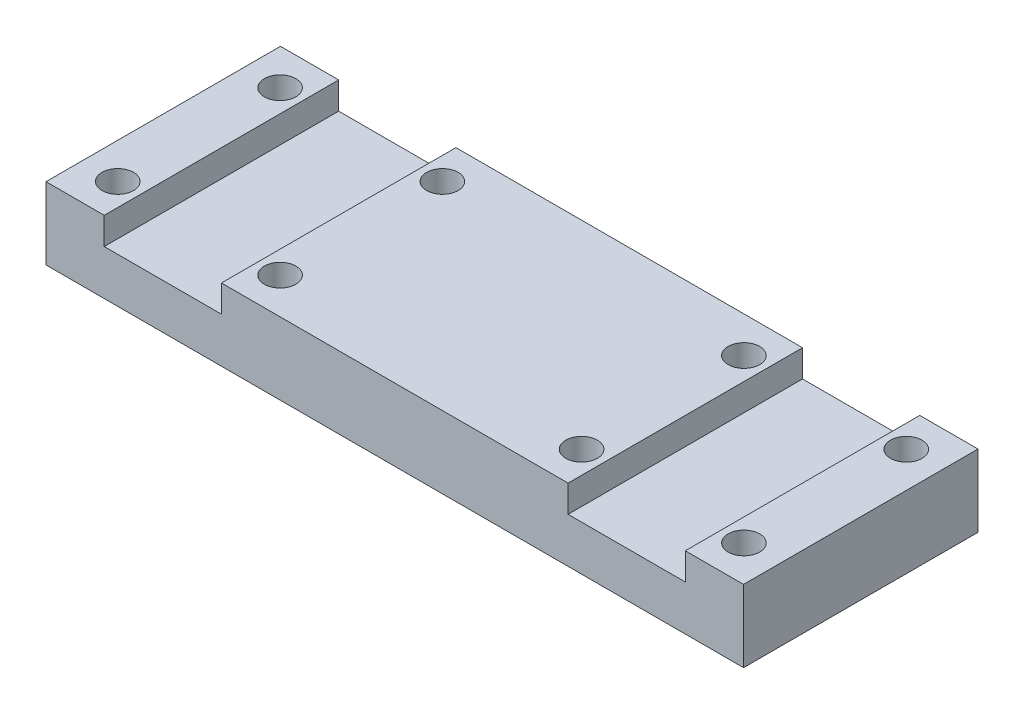
ISO-10303-21;
HEADER;
FILE_DESCRIPTION(('STEP AP214'),'2;1');
FILE_NAME('part.step','',(''),(''),'','','');
FILE_SCHEMA(('AUTOMOTIVE_DESIGN { 1 0 10303 214 1 1 1 1 }'));
ENDSEC;
DATA;
#1=APPLICATION_CONTEXT('core data for automotive mechanical design processes');
#2=APPLICATION_PROTOCOL_DEFINITION('international standard','automotive_design',2000,#1);
#3=PRODUCT_CONTEXT('',#1,'mechanical');
#4=PRODUCT('Part','Part','',(#3));
#5=PRODUCT_RELATED_PRODUCT_CATEGORY('part','',(#4));
#6=PRODUCT_DEFINITION_FORMATION('','',#4);
#7=PRODUCT_DEFINITION_CONTEXT('part definition',#1,'design');
#8=PRODUCT_DEFINITION('design','',#6,#7);
#9=PRODUCT_DEFINITION_SHAPE('','',#8);
#10=(LENGTH_UNIT() NAMED_UNIT(*) SI_UNIT(.MILLI.,.METRE.));
#11=(NAMED_UNIT(*) PLANE_ANGLE_UNIT() SI_UNIT($,.RADIAN.));
#12=(NAMED_UNIT(*) SI_UNIT($,.STERADIAN.) SOLID_ANGLE_UNIT());
#13=UNCERTAINTY_MEASURE_WITH_UNIT(LENGTH_MEASURE(1.E-05),#10,'distance_accuracy_value','');
#14=(GEOMETRIC_REPRESENTATION_CONTEXT(3) GLOBAL_UNCERTAINTY_ASSIGNED_CONTEXT((#13)) GLOBAL_UNIT_ASSIGNED_CONTEXT((#10,
#11,#12)) REPRESENTATION_CONTEXT('',''));
#15=CARTESIAN_POINT('',(0.,0.,0.));
#16=DIRECTION('',(0.,0.,1.));
#17=DIRECTION('',(1.,0.,0.));
#18=AXIS2_PLACEMENT_3D('',#15,#16,#17);
#19=CARTESIAN_POINT('',(-77.35,16.,-26.));
#20=DIRECTION('',(0.,0.,1.));
#21=DIRECTION('',(1.,0.,0.));
#22=AXIS2_PLACEMENT_3D('',#19,#20,#21);
#23=PLANE('',#22);
#24=DIRECTION('',(0.,-1.,0.));
#25=VECTOR('',#24,1.);
#26=CARTESIAN_POINT('',(64.4356385093033,16.,-26.));
#27=LINE('',#26,#25);
#28=CARTESIAN_POINT('',(64.4356385093033,16.,-26.));
#29=VERTEX_POINT('',#28);
#30=CARTESIAN_POINT('',(64.4356385093032,10.,-26.));
#31=VERTEX_POINT('',#30);
#32=EDGE_CURVE('E126',#29,#31,#27,.T.);
#33=ORIENTED_EDGE('',*,*,#32,.F.);
#34=DIRECTION('',(-1.,0.,0.));
#35=VECTOR('',#34,1.);
#36=CARTESIAN_POINT('',(-77.35,16.,-26.));
#37=LINE('',#36,#35);
#38=CARTESIAN_POINT('',(77.35,16.,-26.));
#39=VERTEX_POINT('',#38);
#40=EDGE_CURVE('E138',#39,#29,#37,.T.);
#41=ORIENTED_EDGE('',*,*,#40,.F.);
#42=DIRECTION('',(0.,-1.,0.));
#43=VECTOR('',#42,1.);
#44=CARTESIAN_POINT('',(77.35,16.,-26.));
#45=LINE('',#44,#43);
#46=CARTESIAN_POINT('',(77.35,0.,-26.));
#47=VERTEX_POINT('',#46);
#48=EDGE_CURVE('E11',#39,#47,#45,.T.);
#49=ORIENTED_EDGE('',*,*,#48,.T.);
#50=DIRECTION('',(-1.,0.,0.));
#51=VECTOR('',#50,1.);
#52=CARTESIAN_POINT('',(-77.35,0.,-26.));
#53=LINE('',#52,#51);
#54=CARTESIAN_POINT('',(-77.35,0.,-26.));
#55=VERTEX_POINT('',#54);
#56=EDGE_CURVE('E272',#47,#55,#53,.T.);
#57=ORIENTED_EDGE('',*,*,#56,.T.);
#58=DIRECTION('',(0.,-1.,0.));
#59=VECTOR('',#58,1.);
#60=CARTESIAN_POINT('',(-77.35,16.,-26.));
#61=LINE('',#60,#59);
#62=CARTESIAN_POINT('',(-77.35,16.,-26.));
#63=VERTEX_POINT('',#62);
#64=EDGE_CURVE('E40',#63,#55,#61,.T.);
#65=ORIENTED_EDGE('',*,*,#64,.F.);
#66=CARTESIAN_POINT('',(-64.4356385093033,16.,-26.));
#67=VERTEX_POINT('',#66);
#68=EDGE_CURVE('E149',#67,#63,#37,.T.);
#69=ORIENTED_EDGE('',*,*,#68,.F.);
#70=DIRECTION('',(0.,-1.,0.));
#71=VECTOR('',#70,1.);
#72=CARTESIAN_POINT('',(-64.4356385093033,16.,-26.));
#73=LINE('',#72,#71);
#74=CARTESIAN_POINT('',(-64.4356385093032,10.,-26.));
#75=VERTEX_POINT('',#74);
#76=EDGE_CURVE('E220',#67,#75,#73,.T.);
#77=ORIENTED_EDGE('',*,*,#76,.T.);
#78=DIRECTION('',(1.,0.,0.));
#79=VECTOR('',#78,1.);
#80=CARTESIAN_POINT('',(-64.4356385093032,10.,-26.));
#81=LINE('',#80,#79);
#82=CARTESIAN_POINT('',(-38.4356385093032,10.,-26.));
#83=VERTEX_POINT('',#82);
#84=EDGE_CURVE('E230',#75,#83,#81,.T.);
#85=ORIENTED_EDGE('',*,*,#84,.T.);
#86=DIRECTION('',(0.,1.,0.));
#87=VECTOR('',#86,1.);
#88=CARTESIAN_POINT('',(-38.4356385093032,16.,-26.));
#89=LINE('',#88,#87);
#90=CARTESIAN_POINT('',(-38.4356385093032,16.,-26.));
#91=VERTEX_POINT('',#90);
#92=EDGE_CURVE('E214',#83,#91,#89,.T.);
#93=ORIENTED_EDGE('',*,*,#92,.T.);
#94=CARTESIAN_POINT('',(38.4356385093032,16.,-26.));
#95=VERTEX_POINT('',#94);
#96=EDGE_CURVE('E147',#95,#91,#37,.T.);
#97=ORIENTED_EDGE('',*,*,#96,.F.);
#98=DIRECTION('',(0.,1.,0.));
#99=VECTOR('',#98,1.);
#100=CARTESIAN_POINT('',(38.4356385093032,16.,-26.));
#101=LINE('',#100,#99);
#102=CARTESIAN_POINT('',(38.4356385093032,10.,-26.));
#103=VERTEX_POINT('',#102);
#104=EDGE_CURVE('E47',#103,#95,#101,.T.);
#105=ORIENTED_EDGE('',*,*,#104,.F.);
#106=DIRECTION('',(-1.,0.,0.));
#107=VECTOR('',#106,1.);
#108=CARTESIAN_POINT('',(64.4356385093032,10.,-26.));
#109=LINE('',#108,#107);
#110=EDGE_CURVE('E134',#31,#103,#109,.T.);
#111=ORIENTED_EDGE('',*,*,#110,.F.);
#112=EDGE_LOOP('',(#33,#41,#49,#57,#65,#69,#77,#85,#93,#97,#105,#111));
#113=FACE_BOUND('',#112,.T.);
#114=ADVANCED_FACE('F32',(#113),#23,.F.);
#115=CARTESIAN_POINT('',(-77.35,16.,26.));
#116=DIRECTION('',(0.,0.,-1.));
#117=DIRECTION('',(-1.,0.,0.));
#118=AXIS2_PLACEMENT_3D('',#115,#116,#117);
#119=PLANE('',#118);
#120=DIRECTION('',(0.,-1.,0.));
#121=VECTOR('',#120,1.);
#122=CARTESIAN_POINT('',(64.4356385093033,16.,26.));
#123=LINE('',#122,#121);
#124=CARTESIAN_POINT('',(64.4356385093033,16.,26.));
#125=VERTEX_POINT('',#124);
#126=CARTESIAN_POINT('',(64.4356385093032,10.,26.));
#127=VERTEX_POINT('',#126);
#128=EDGE_CURVE('E129',#125,#127,#123,.T.);
#129=ORIENTED_EDGE('',*,*,#128,.T.);
#130=DIRECTION('',(-1.,0.,0.));
#131=VECTOR('',#130,1.);
#132=CARTESIAN_POINT('',(64.4356385093032,10.,26.));
#133=LINE('',#132,#131);
#134=CARTESIAN_POINT('',(38.4356385093032,10.,26.));
#135=VERTEX_POINT('',#134);
#136=EDGE_CURVE('E140',#127,#135,#133,.T.);
#137=ORIENTED_EDGE('',*,*,#136,.T.);
#138=DIRECTION('',(0.,1.,0.));
#139=VECTOR('',#138,1.);
#140=CARTESIAN_POINT('',(38.4356385093032,16.,26.));
#141=LINE('',#140,#139);
#142=CARTESIAN_POINT('',(38.4356385093032,16.,26.));
#143=VERTEX_POINT('',#142);
#144=EDGE_CURVE('E241',#135,#143,#141,.T.);
#145=ORIENTED_EDGE('',*,*,#144,.T.);
#146=DIRECTION('',(1.,0.,0.));
#147=VECTOR('',#146,1.);
#148=CARTESIAN_POINT('',(-77.35,16.,26.));
#149=LINE('',#148,#147);
#150=CARTESIAN_POINT('',(-38.4356385093032,16.,26.));
#151=VERTEX_POINT('',#150);
#152=EDGE_CURVE('E264',#151,#143,#149,.T.);
#153=ORIENTED_EDGE('',*,*,#152,.F.);
#154=DIRECTION('',(0.,1.,0.));
#155=VECTOR('',#154,1.);
#156=CARTESIAN_POINT('',(-38.4356385093032,16.,26.));
#157=LINE('',#156,#155);
#158=CARTESIAN_POINT('',(-38.4356385093032,10.,26.));
#159=VERTEX_POINT('',#158);
#160=EDGE_CURVE('E55',#159,#151,#157,.T.);
#161=ORIENTED_EDGE('',*,*,#160,.F.);
#162=DIRECTION('',(1.,0.,0.));
#163=VECTOR('',#162,1.);
#164=CARTESIAN_POINT('',(-64.4356385093032,10.,26.));
#165=LINE('',#164,#163);
#166=CARTESIAN_POINT('',(-64.4356385093032,10.,26.));
#167=VERTEX_POINT('',#166);
#168=EDGE_CURVE('E221',#167,#159,#165,.T.);
#169=ORIENTED_EDGE('',*,*,#168,.F.);
#170=DIRECTION('',(0.,-1.,0.));
#171=VECTOR('',#170,1.);
#172=CARTESIAN_POINT('',(-64.4356385093033,16.,26.));
#173=LINE('',#172,#171);
#174=CARTESIAN_POINT('',(-64.4356385093033,16.,26.));
#175=VERTEX_POINT('',#174);
#176=EDGE_CURVE('E224',#175,#167,#173,.T.);
#177=ORIENTED_EDGE('',*,*,#176,.F.);
#178=CARTESIAN_POINT('',(-77.35,16.,26.));
#179=VERTEX_POINT('',#178);
#180=EDGE_CURVE('E265',#179,#175,#149,.T.);
#181=ORIENTED_EDGE('',*,*,#180,.F.);
#182=DIRECTION('',(0.,-1.,0.));
#183=VECTOR('',#182,1.);
#184=CARTESIAN_POINT('',(-77.35,16.,26.));
#185=LINE('',#184,#183);
#186=CARTESIAN_POINT('',(-77.35,0.,26.));
#187=VERTEX_POINT('',#186);
#188=EDGE_CURVE('E277',#179,#187,#185,.T.);
#189=ORIENTED_EDGE('',*,*,#188,.T.);
#190=DIRECTION('',(1.,0.,0.));
#191=VECTOR('',#190,1.);
#192=CARTESIAN_POINT('',(-77.35,0.,26.));
#193=LINE('',#192,#191);
#194=CARTESIAN_POINT('',(77.35,0.,26.));
#195=VERTEX_POINT('',#194);
#196=EDGE_CURVE('E157',#187,#195,#193,.T.);
#197=ORIENTED_EDGE('',*,*,#196,.T.);
#198=DIRECTION('',(0.,-1.,0.));
#199=VECTOR('',#198,1.);
#200=CARTESIAN_POINT('',(77.35,16.,26.));
#201=LINE('',#200,#199);
#202=CARTESIAN_POINT('',(77.35,16.,26.));
#203=VERTEX_POINT('',#202);
#204=EDGE_CURVE('E268',#203,#195,#201,.T.);
#205=ORIENTED_EDGE('',*,*,#204,.F.);
#206=EDGE_CURVE('E150',#125,#203,#149,.T.);
#207=ORIENTED_EDGE('',*,*,#206,.F.);
#208=EDGE_LOOP('',(#129,#137,#145,#153,#161,#169,#177,#181,#189,#197,#205,#207));
#209=FACE_BOUND('',#208,.T.);
#210=ADVANCED_FACE('F263',(#209),#119,.F.);
#211=CARTESIAN_POINT('',(0.,16.,0.));
#212=DIRECTION('',(0.,-1.,0.));
#213=DIRECTION('',(0.,0.,-1.));
#214=AXIS2_PLACEMENT_3D('',#211,#212,#213);
#215=PLANE('',#214);
#216=CARTESIAN_POINT('',(69.4356385093032,16.,18.));
#217=DIRECTION('',(0.,-1.,0.));
#218=DIRECTION('',(0.,0.,1.));
#219=AXIS2_PLACEMENT_3D('',#216,#217,#218);
#220=CIRCLE('',#219,3.50000000000001);
#221=CARTESIAN_POINT('',(69.4356385093032,16.,21.5));
#222=VERTEX_POINT('',#221);
#223=EDGE_CURVE('E193',#222,#222,#220,.T.);
#224=ORIENTED_EDGE('',*,*,#223,.T.);
#225=EDGE_LOOP('',(#224));
#226=FACE_BOUND('',#225,.T.);
#227=CARTESIAN_POINT('',(69.4356385093032,16.,-18.));
#228=DIRECTION('',(0.,-1.,0.));
#229=DIRECTION('',(0.,0.,1.));
#230=AXIS2_PLACEMENT_3D('',#227,#228,#229);
#231=CIRCLE('',#230,3.50000000000001);
#232=CARTESIAN_POINT('',(69.4356385093032,16.,-14.5));
#233=VERTEX_POINT('',#232);
#234=EDGE_CURVE('E206',#233,#233,#231,.T.);
#235=ORIENTED_EDGE('',*,*,#234,.T.);
#236=EDGE_LOOP('',(#235));
#237=FACE_BOUND('',#236,.T.);
#238=DIRECTION('',(0.,0.,1.));
#239=VECTOR('',#238,1.);
#240=CARTESIAN_POINT('',(64.4356385093033,16.,-26.));
#241=LINE('',#240,#239);
#242=EDGE_CURVE('E122',#29,#125,#241,.T.);
#243=ORIENTED_EDGE('',*,*,#242,.T.);
#244=ORIENTED_EDGE('',*,*,#206,.T.);
#245=DIRECTION('',(0.,0.,-1.));
#246=VECTOR('',#245,1.);
#247=CARTESIAN_POINT('',(77.35,16.,26.));
#248=LINE('',#247,#246);
#249=EDGE_CURVE('E144',#203,#39,#248,.T.);
#250=ORIENTED_EDGE('',*,*,#249,.T.);
#251=ORIENTED_EDGE('',*,*,#40,.T.);
#252=EDGE_LOOP('',(#243,#244,#250,#251));
#253=FACE_BOUND('',#252,.T.);
#254=ADVANCED_FACE('F142',(#226,#237,#253),#215,.F.);
#255=CARTESIAN_POINT('',(-33.4356385093032,16.,-18.));
#256=DIRECTION('',(0.,1.,0.));
#257=DIRECTION('',(0.,0.,1.));
#258=AXIS2_PLACEMENT_3D('',#255,#256,#257);
#259=CIRCLE('',#258,3.5);
#260=CARTESIAN_POINT('',(-33.4356385093032,16.,-14.5));
#261=VERTEX_POINT('',#260);
#262=EDGE_CURVE('E161',#261,#261,#259,.T.);
#263=ORIENTED_EDGE('',*,*,#262,.F.);
#264=EDGE_LOOP('',(#263));
#265=FACE_BOUND('',#264,.T.);
#266=CARTESIAN_POINT('',(-33.4356385093032,16.,18.));
#267=DIRECTION('',(0.,1.,0.));
#268=DIRECTION('',(0.,0.,1.));
#269=AXIS2_PLACEMENT_3D('',#266,#267,#268);
#270=CIRCLE('',#269,3.5);
#271=CARTESIAN_POINT('',(-33.4356385093032,16.,21.5));
#272=VERTEX_POINT('',#271);
#273=EDGE_CURVE('E176',#272,#272,#270,.T.);
#274=ORIENTED_EDGE('',*,*,#273,.F.);
#275=EDGE_LOOP('',(#274));
#276=FACE_BOUND('',#275,.T.);
#277=CARTESIAN_POINT('',(33.4356385093032,16.,-18.));
#278=DIRECTION('',(0.,-1.,0.));
#279=DIRECTION('',(0.,0.,1.));
#280=AXIS2_PLACEMENT_3D('',#277,#278,#279);
#281=CIRCLE('',#280,3.5);
#282=CARTESIAN_POINT('',(33.4356385093032,16.,-14.5));
#283=VERTEX_POINT('',#282);
#284=EDGE_CURVE('E187',#283,#283,#281,.T.);
#285=ORIENTED_EDGE('',*,*,#284,.T.);
#286=EDGE_LOOP('',(#285));
#287=FACE_BOUND('',#286,.T.);
#288=CARTESIAN_POINT('',(33.4356385093032,16.,18.));
#289=DIRECTION('',(0.,-1.,0.));
#290=DIRECTION('',(0.,0.,1.));
#291=AXIS2_PLACEMENT_3D('',#288,#289,#290);
#292=CIRCLE('',#291,3.5);
#293=CARTESIAN_POINT('',(33.4356385093032,16.,21.5));
#294=VERTEX_POINT('',#293);
#295=EDGE_CURVE('E200',#294,#294,#292,.T.);
#296=ORIENTED_EDGE('',*,*,#295,.T.);
#297=EDGE_LOOP('',(#296));
#298=FACE_BOUND('',#297,.T.);
#299=DIRECTION('',(0.,0.,1.));
#300=VECTOR('',#299,1.);
#301=CARTESIAN_POINT('',(38.4356385093032,16.,-26.));
#302=LINE('',#301,#300);
#303=EDGE_CURVE('E133',#95,#143,#302,.T.);
#304=ORIENTED_EDGE('',*,*,#303,.F.);
#305=ORIENTED_EDGE('',*,*,#96,.T.);
#306=DIRECTION('',(0.,0.,1.));
#307=VECTOR('',#306,1.);
#308=CARTESIAN_POINT('',(-38.4356385093032,16.,-26.));
#309=LINE('',#308,#307);
#310=EDGE_CURVE('E216',#91,#151,#309,.T.);
#311=ORIENTED_EDGE('',*,*,#310,.T.);
#312=ORIENTED_EDGE('',*,*,#152,.T.);
#313=EDGE_LOOP('',(#304,#305,#311,#312));
#314=FACE_BOUND('',#313,.T.);
#315=ADVANCED_FACE('F253',(#265,#276,#287,#298,#314),#215,.F.);
#316=CARTESIAN_POINT('',(-69.4356385093032,16.,18.));
#317=DIRECTION('',(0.,1.,0.));
#318=DIRECTION('',(0.,0.,1.));
#319=AXIS2_PLACEMENT_3D('',#316,#317,#318);
#320=CIRCLE('',#319,3.50000000000001);
#321=CARTESIAN_POINT('',(-69.4356385093032,16.,21.5));
#322=VERTEX_POINT('',#321);
#323=EDGE_CURVE('E169',#322,#322,#320,.T.);
#324=ORIENTED_EDGE('',*,*,#323,.F.);
#325=EDGE_LOOP('',(#324));
#326=FACE_BOUND('',#325,.T.);
#327=CARTESIAN_POINT('',(-69.4356385093032,16.,-18.));
#328=DIRECTION('',(0.,1.,0.));
#329=DIRECTION('',(0.,0.,1.));
#330=AXIS2_PLACEMENT_3D('',#327,#328,#329);
#331=CIRCLE('',#330,3.50000000000001);
#332=CARTESIAN_POINT('',(-69.4356385093032,16.,-14.5));
#333=VERTEX_POINT('',#332);
#334=EDGE_CURVE('E182',#333,#333,#331,.T.);
#335=ORIENTED_EDGE('',*,*,#334,.F.);
#336=EDGE_LOOP('',(#335));
#337=FACE_BOUND('',#336,.T.);
#338=ORIENTED_EDGE('',*,*,#180,.T.);
#339=DIRECTION('',(0.,0.,1.));
#340=VECTOR('',#339,1.);
#341=CARTESIAN_POINT('',(-64.4356385093033,16.,-26.));
#342=LINE('',#341,#340);
#343=EDGE_CURVE('E197',#67,#175,#342,.T.);
#344=ORIENTED_EDGE('',*,*,#343,.F.);
#345=ORIENTED_EDGE('',*,*,#68,.T.);
#346=DIRECTION('',(0.,0.,1.));
#347=VECTOR('',#346,1.);
#348=CARTESIAN_POINT('',(-77.35,16.,26.));
#349=LINE('',#348,#347);
#350=EDGE_CURVE('E146',#63,#179,#349,.T.);
#351=ORIENTED_EDGE('',*,*,#350,.T.);
#352=EDGE_LOOP('',(#338,#344,#345,#351));
#353=FACE_BOUND('',#352,.T.);
#354=ADVANCED_FACE('F293',(#326,#337,#353),#215,.F.);
#355=CARTESIAN_POINT('',(77.35,16.,26.));
#356=DIRECTION('',(-1.,0.,0.));
#357=DIRECTION('',(0.,0.,1.));
#358=AXIS2_PLACEMENT_3D('',#355,#356,#357);
#359=PLANE('',#358);
#360=DIRECTION('',(0.,0.,-1.));
#361=VECTOR('',#360,1.);
#362=CARTESIAN_POINT('',(77.35,0.,26.));
#363=LINE('',#362,#361);
#364=EDGE_CURVE('E168',#195,#47,#363,.T.);
#365=ORIENTED_EDGE('',*,*,#364,.T.);
#366=ORIENTED_EDGE('',*,*,#48,.F.);
#367=ORIENTED_EDGE('',*,*,#249,.F.);
#368=ORIENTED_EDGE('',*,*,#204,.T.);
#369=EDGE_LOOP('',(#365,#366,#367,#368));
#370=FACE_BOUND('',#369,.T.);
#371=ADVANCED_FACE('F34',(#370),#359,.F.);
#372=CARTESIAN_POINT('',(-77.35,16.,26.));
#373=DIRECTION('',(1.,0.,0.));
#374=DIRECTION('',(0.,0.,-1.));
#375=AXIS2_PLACEMENT_3D('',#372,#373,#374);
#376=PLANE('',#375);
#377=DIRECTION('',(0.,0.,1.));
#378=VECTOR('',#377,1.);
#379=CARTESIAN_POINT('',(-77.35,0.,26.));
#380=LINE('',#379,#378);
#381=EDGE_CURVE('E158',#55,#187,#380,.T.);
#382=ORIENTED_EDGE('',*,*,#381,.T.);
#383=ORIENTED_EDGE('',*,*,#188,.F.);
#384=ORIENTED_EDGE('',*,*,#350,.F.);
#385=ORIENTED_EDGE('',*,*,#64,.T.);
#386=EDGE_LOOP('',(#382,#383,#384,#385));
#387=FACE_BOUND('',#386,.T.);
#388=ADVANCED_FACE('F283',(#387),#376,.F.);
#389=CARTESIAN_POINT('',(0.,0.,0.));
#390=DIRECTION('',(0.,-1.,0.));
#391=DIRECTION('',(0.,0.,-1.));
#392=AXIS2_PLACEMENT_3D('',#389,#390,#391);
#393=PLANE('',#392);
#394=CARTESIAN_POINT('',(69.4356385093032,0.,-18.));
#395=DIRECTION('',(0.,-1.,0.));
#396=DIRECTION('',(0.,0.,1.));
#397=AXIS2_PLACEMENT_3D('',#394,#395,#396);
#398=CIRCLE('',#397,3.50000000000001);
#399=CARTESIAN_POINT('',(69.4356385093032,0.,-14.5));
#400=VERTEX_POINT('',#399);
#401=EDGE_CURVE('E190',#400,#400,#398,.T.);
#402=ORIENTED_EDGE('',*,*,#401,.F.);
#403=EDGE_LOOP('',(#402));
#404=FACE_BOUND('',#403,.T.);
#405=CARTESIAN_POINT('',(33.4356385093032,0.,18.));
#406=DIRECTION('',(0.,-1.,0.));
#407=DIRECTION('',(0.,0.,1.));
#408=AXIS2_PLACEMENT_3D('',#405,#406,#407);
#409=CIRCLE('',#408,3.5);
#410=CARTESIAN_POINT('',(33.4356385093032,0.,21.5));
#411=VERTEX_POINT('',#410);
#412=EDGE_CURVE('E203',#411,#411,#409,.T.);
#413=ORIENTED_EDGE('',*,*,#412,.F.);
#414=EDGE_LOOP('',(#413));
#415=FACE_BOUND('',#414,.T.);
#416=CARTESIAN_POINT('',(69.4356385093032,0.,18.));
#417=DIRECTION('',(0.,-1.,0.));
#418=DIRECTION('',(0.,0.,1.));
#419=AXIS2_PLACEMENT_3D('',#416,#417,#418);
#420=CIRCLE('',#419,3.50000000000001);
#421=CARTESIAN_POINT('',(69.4356385093032,0.,21.5));
#422=VERTEX_POINT('',#421);
#423=EDGE_CURVE('E196',#422,#422,#420,.T.);
#424=ORIENTED_EDGE('',*,*,#423,.F.);
#425=EDGE_LOOP('',(#424));
#426=FACE_BOUND('',#425,.T.);
#427=CARTESIAN_POINT('',(33.4356385093032,0.,-18.));
#428=DIRECTION('',(0.,-1.,0.));
#429=DIRECTION('',(0.,0.,1.));
#430=AXIS2_PLACEMENT_3D('',#427,#428,#429);
#431=CIRCLE('',#430,3.5);
#432=CARTESIAN_POINT('',(33.4356385093032,0.,-14.5));
#433=VERTEX_POINT('',#432);
#434=EDGE_CURVE('E173',#433,#433,#431,.T.);
#435=ORIENTED_EDGE('',*,*,#434,.F.);
#436=EDGE_LOOP('',(#435));
#437=FACE_BOUND('',#436,.T.);
#438=CARTESIAN_POINT('',(-69.4356385093032,0.,-18.));
#439=DIRECTION('',(0.,1.,0.));
#440=DIRECTION('',(0.,0.,1.));
#441=AXIS2_PLACEMENT_3D('',#438,#439,#440);
#442=CIRCLE('',#441,3.50000000000001);
#443=CARTESIAN_POINT('',(-69.4356385093032,0.,-14.5));
#444=VERTEX_POINT('',#443);
#445=EDGE_CURVE('E165',#444,#444,#442,.T.);
#446=ORIENTED_EDGE('',*,*,#445,.T.);
#447=EDGE_LOOP('',(#446));
#448=FACE_BOUND('',#447,.T.);
#449=CARTESIAN_POINT('',(-33.4356385093032,0.,18.));
#450=DIRECTION('',(0.,1.,0.));
#451=DIRECTION('',(0.,0.,1.));
#452=AXIS2_PLACEMENT_3D('',#449,#450,#451);
#453=CIRCLE('',#452,3.5);
#454=CARTESIAN_POINT('',(-33.4356385093032,0.,21.5));
#455=VERTEX_POINT('',#454);
#456=EDGE_CURVE('E179',#455,#455,#453,.T.);
#457=ORIENTED_EDGE('',*,*,#456,.T.);
#458=EDGE_LOOP('',(#457));
#459=FACE_BOUND('',#458,.T.);
#460=CARTESIAN_POINT('',(-69.4356385093032,0.,18.));
#461=DIRECTION('',(0.,1.,0.));
#462=DIRECTION('',(0.,0.,1.));
#463=AXIS2_PLACEMENT_3D('',#460,#461,#462);
#464=CIRCLE('',#463,3.50000000000001);
#465=CARTESIAN_POINT('',(-69.4356385093032,0.,21.5));
#466=VERTEX_POINT('',#465);
#467=EDGE_CURVE('E172',#466,#466,#464,.T.);
#468=ORIENTED_EDGE('',*,*,#467,.T.);
#469=EDGE_LOOP('',(#468));
#470=FACE_BOUND('',#469,.T.);
#471=CARTESIAN_POINT('',(-33.4356385093032,0.,-18.));
#472=DIRECTION('',(0.,1.,0.));
#473=DIRECTION('',(0.,0.,1.));
#474=AXIS2_PLACEMENT_3D('',#471,#472,#473);
#475=CIRCLE('',#474,3.5);
#476=CARTESIAN_POINT('',(-33.4356385093032,0.,-14.5));
#477=VERTEX_POINT('',#476);
#478=EDGE_CURVE('E164',#477,#477,#475,.T.);
#479=ORIENTED_EDGE('',*,*,#478,.T.);
#480=EDGE_LOOP('',(#479));
#481=FACE_BOUND('',#480,.T.);
#482=ORIENTED_EDGE('',*,*,#364,.F.);
#483=ORIENTED_EDGE('',*,*,#196,.F.);
#484=ORIENTED_EDGE('',*,*,#381,.F.);
#485=ORIENTED_EDGE('',*,*,#56,.F.);
#486=EDGE_LOOP('',(#482,#483,#484,#485));
#487=FACE_BOUND('',#486,.T.);
#488=ADVANCED_FACE('F288',(#404,#415,#426,#437,#448,#459,#470,#481,#487),#393,.T.);
#489=CARTESIAN_POINT('',(-33.4356385093032,0.,-18.));
#490=DIRECTION('',(0.,1.,0.));
#491=DIRECTION('',(0.,0.,1.));
#492=AXIS2_PLACEMENT_3D('',#489,#490,#491);
#493=CYLINDRICAL_SURFACE('',#492,3.5);
#494=ORIENTED_EDGE('',*,*,#478,.F.);
#495=EDGE_LOOP('',(#494));
#496=FACE_BOUND('',#495,.T.);
#497=ORIENTED_EDGE('',*,*,#262,.T.);
#498=EDGE_LOOP('',(#497));
#499=FACE_BOUND('',#498,.T.);
#500=ADVANCED_FACE('F308',(#496,#499),#493,.F.);
#501=CARTESIAN_POINT('',(-69.4356385093032,0.,18.));
#502=DIRECTION('',(0.,1.,0.));
#503=DIRECTION('',(0.,0.,1.));
#504=AXIS2_PLACEMENT_3D('',#501,#502,#503);
#505=CYLINDRICAL_SURFACE('',#504,3.50000000000001);
#506=ORIENTED_EDGE('',*,*,#467,.F.);
#507=EDGE_LOOP('',(#506));
#508=FACE_BOUND('',#507,.T.);
#509=ORIENTED_EDGE('',*,*,#323,.T.);
#510=EDGE_LOOP('',(#509));
#511=FACE_BOUND('',#510,.T.);
#512=ADVANCED_FACE('F315',(#508,#511),#505,.F.);
#513=CARTESIAN_POINT('',(-33.4356385093032,0.,18.));
#514=DIRECTION('',(0.,1.,0.));
#515=DIRECTION('',(0.,0.,1.));
#516=AXIS2_PLACEMENT_3D('',#513,#514,#515);
#517=CYLINDRICAL_SURFACE('',#516,3.5);
#518=ORIENTED_EDGE('',*,*,#456,.F.);
#519=EDGE_LOOP('',(#518));
#520=FACE_BOUND('',#519,.T.);
#521=ORIENTED_EDGE('',*,*,#273,.T.);
#522=EDGE_LOOP('',(#521));
#523=FACE_BOUND('',#522,.T.);
#524=ADVANCED_FACE('F319',(#520,#523),#517,.F.);
#525=CARTESIAN_POINT('',(-69.4356385093032,0.,-18.));
#526=DIRECTION('',(0.,1.,0.));
#527=DIRECTION('',(0.,0.,1.));
#528=AXIS2_PLACEMENT_3D('',#525,#526,#527);
#529=CYLINDRICAL_SURFACE('',#528,3.50000000000001);
#530=ORIENTED_EDGE('',*,*,#445,.F.);
#531=EDGE_LOOP('',(#530));
#532=FACE_BOUND('',#531,.T.);
#533=ORIENTED_EDGE('',*,*,#334,.T.);
#534=EDGE_LOOP('',(#533));
#535=FACE_BOUND('',#534,.T.);
#536=ADVANCED_FACE('F323',(#532,#535),#529,.F.);
#537=CARTESIAN_POINT('',(33.4356385093032,0.,-18.));
#538=DIRECTION('',(0.,1.,0.));
#539=DIRECTION('',(0.,0.,1.));
#540=AXIS2_PLACEMENT_3D('',#537,#538,#539);
#541=CYLINDRICAL_SURFACE('',#540,3.5);
#542=ORIENTED_EDGE('',*,*,#434,.T.);
#543=EDGE_LOOP('',(#542));
#544=FACE_BOUND('',#543,.T.);
#545=ORIENTED_EDGE('',*,*,#284,.F.);
#546=EDGE_LOOP('',(#545));
#547=FACE_BOUND('',#546,.T.);
#548=ADVANCED_FACE('F327',(#544,#547),#541,.F.);
#549=CARTESIAN_POINT('',(69.4356385093032,0.,18.));
#550=DIRECTION('',(0.,1.,0.));
#551=DIRECTION('',(0.,0.,1.));
#552=AXIS2_PLACEMENT_3D('',#549,#550,#551);
#553=CYLINDRICAL_SURFACE('',#552,3.50000000000001);
#554=ORIENTED_EDGE('',*,*,#423,.T.);
#555=EDGE_LOOP('',(#554));
#556=FACE_BOUND('',#555,.T.);
#557=ORIENTED_EDGE('',*,*,#223,.F.);
#558=EDGE_LOOP('',(#557));
#559=FACE_BOUND('',#558,.T.);
#560=ADVANCED_FACE('F331',(#556,#559),#553,.F.);
#561=CARTESIAN_POINT('',(33.4356385093032,0.,18.));
#562=DIRECTION('',(0.,1.,0.));
#563=DIRECTION('',(0.,0.,1.));
#564=AXIS2_PLACEMENT_3D('',#561,#562,#563);
#565=CYLINDRICAL_SURFACE('',#564,3.5);
#566=ORIENTED_EDGE('',*,*,#412,.T.);
#567=EDGE_LOOP('',(#566));
#568=FACE_BOUND('',#567,.T.);
#569=ORIENTED_EDGE('',*,*,#295,.F.);
#570=EDGE_LOOP('',(#569));
#571=FACE_BOUND('',#570,.T.);
#572=ADVANCED_FACE('F335',(#568,#571),#565,.F.);
#573=CARTESIAN_POINT('',(69.4356385093032,0.,-18.));
#574=DIRECTION('',(0.,1.,0.));
#575=DIRECTION('',(0.,0.,1.));
#576=AXIS2_PLACEMENT_3D('',#573,#574,#575);
#577=CYLINDRICAL_SURFACE('',#576,3.50000000000001);
#578=ORIENTED_EDGE('',*,*,#401,.T.);
#579=EDGE_LOOP('',(#578));
#580=FACE_BOUND('',#579,.T.);
#581=ORIENTED_EDGE('',*,*,#234,.F.);
#582=EDGE_LOOP('',(#581));
#583=FACE_BOUND('',#582,.T.);
#584=ADVANCED_FACE('F339',(#580,#583),#577,.F.);
#585=CARTESIAN_POINT('',(-64.4356385093033,16.,-26.));
#586=DIRECTION('',(-1.,0.,0.));
#587=DIRECTION('',(0.,-1.,0.));
#588=AXIS2_PLACEMENT_3D('',#585,#586,#587);
#589=PLANE('',#588);
#590=ORIENTED_EDGE('',*,*,#176,.T.);
#591=DIRECTION('',(0.,0.,1.));
#592=VECTOR('',#591,1.);
#593=CARTESIAN_POINT('',(-64.4356385093032,10.,-26.));
#594=LINE('',#593,#592);
#595=EDGE_CURVE('E211',#75,#167,#594,.T.);
#596=ORIENTED_EDGE('',*,*,#595,.F.);
#597=ORIENTED_EDGE('',*,*,#76,.F.);
#598=ORIENTED_EDGE('',*,*,#343,.T.);
#599=EDGE_LOOP('',(#590,#596,#597,#598));
#600=FACE_BOUND('',#599,.T.);
#601=ADVANCED_FACE('F343',(#600),#589,.F.);
#602=CARTESIAN_POINT('',(-38.4356385093032,16.,-26.));
#603=DIRECTION('',(1.,0.,0.));
#604=DIRECTION('',(0.,1.,0.));
#605=AXIS2_PLACEMENT_3D('',#602,#603,#604);
#606=PLANE('',#605);
#607=ORIENTED_EDGE('',*,*,#160,.T.);
#608=ORIENTED_EDGE('',*,*,#310,.F.);
#609=ORIENTED_EDGE('',*,*,#92,.F.);
#610=DIRECTION('',(0.,0.,1.));
#611=VECTOR('',#610,1.);
#612=CARTESIAN_POINT('',(-38.4356385093032,10.,-26.));
#613=LINE('',#612,#611);
#614=EDGE_CURVE('E213',#83,#159,#613,.T.);
#615=ORIENTED_EDGE('',*,*,#614,.T.);
#616=EDGE_LOOP('',(#607,#608,#609,#615));
#617=FACE_BOUND('',#616,.T.);
#618=ADVANCED_FACE('F256',(#617),#606,.F.);
#619=CARTESIAN_POINT('',(-64.4356385093032,10.,-26.));
#620=DIRECTION('',(0.,-1.,0.));
#621=DIRECTION('',(1.,0.,0.));
#622=AXIS2_PLACEMENT_3D('',#619,#620,#621);
#623=PLANE('',#622);
#624=ORIENTED_EDGE('',*,*,#168,.T.);
#625=ORIENTED_EDGE('',*,*,#614,.F.);
#626=ORIENTED_EDGE('',*,*,#84,.F.);
#627=ORIENTED_EDGE('',*,*,#595,.T.);
#628=EDGE_LOOP('',(#624,#625,#626,#627));
#629=FACE_BOUND('',#628,.T.);
#630=ADVANCED_FACE('F259',(#629),#623,.F.);
#631=CARTESIAN_POINT('',(64.4356385093033,16.,-26.));
#632=DIRECTION('',(-1.,0.,0.));
#633=DIRECTION('',(0.,-1.,0.));
#634=AXIS2_PLACEMENT_3D('',#631,#632,#633);
#635=PLANE('',#634);
#636=ORIENTED_EDGE('',*,*,#128,.F.);
#637=ORIENTED_EDGE('',*,*,#242,.F.);
#638=ORIENTED_EDGE('',*,*,#32,.T.);
#639=DIRECTION('',(0.,0.,1.));
#640=VECTOR('',#639,1.);
#641=CARTESIAN_POINT('',(64.4356385093032,10.,-26.));
#642=LINE('',#641,#640);
#643=EDGE_CURVE('E227',#31,#127,#642,.T.);
#644=ORIENTED_EDGE('',*,*,#643,.T.);
#645=EDGE_LOOP('',(#636,#637,#638,#644));
#646=FACE_BOUND('',#645,.T.);
#647=ADVANCED_FACE('F124',(#646),#635,.T.);
#648=CARTESIAN_POINT('',(64.4356385093032,10.,-26.));
#649=DIRECTION('',(0.,1.,0.));
#650=DIRECTION('',(-1.,0.,0.));
#651=AXIS2_PLACEMENT_3D('',#648,#649,#650);
#652=PLANE('',#651);
#653=ORIENTED_EDGE('',*,*,#136,.F.);
#654=ORIENTED_EDGE('',*,*,#643,.F.);
#655=ORIENTED_EDGE('',*,*,#110,.T.);
#656=DIRECTION('',(0.,0.,1.));
#657=VECTOR('',#656,1.);
#658=CARTESIAN_POINT('',(38.4356385093032,10.,-26.));
#659=LINE('',#658,#657);
#660=EDGE_CURVE('E236',#103,#135,#659,.T.);
#661=ORIENTED_EDGE('',*,*,#660,.T.);
#662=EDGE_LOOP('',(#653,#654,#655,#661));
#663=FACE_BOUND('',#662,.T.);
#664=ADVANCED_FACE('F247',(#663),#652,.T.);
#665=CARTESIAN_POINT('',(38.4356385093032,16.,-26.));
#666=DIRECTION('',(1.,0.,0.));
#667=DIRECTION('',(0.,1.,0.));
#668=AXIS2_PLACEMENT_3D('',#665,#666,#667);
#669=PLANE('',#668);
#670=ORIENTED_EDGE('',*,*,#144,.F.);
#671=ORIENTED_EDGE('',*,*,#660,.F.);
#672=ORIENTED_EDGE('',*,*,#104,.T.);
#673=ORIENTED_EDGE('',*,*,#303,.T.);
#674=EDGE_LOOP('',(#670,#671,#672,#673));
#675=FACE_BOUND('',#674,.T.);
#676=ADVANCED_FACE('F249',(#675),#669,.T.);
#677=CLOSED_SHELL('',(#114,#210,#254,#315,#354,#371,#388,#488,#500,#512,#524,#536,#548,#560,
#572,#584,#601,#618,#630,#647,#664,#676));
#678=MANIFOLD_SOLID_BREP('B2',#677);
#679=ADVANCED_BREP_SHAPE_REPRESENTATION('',(#18,#678),#14);
#680=SHAPE_DEFINITION_REPRESENTATION(#9,#679);
ENDSEC;
END-ISO-10303-21;
